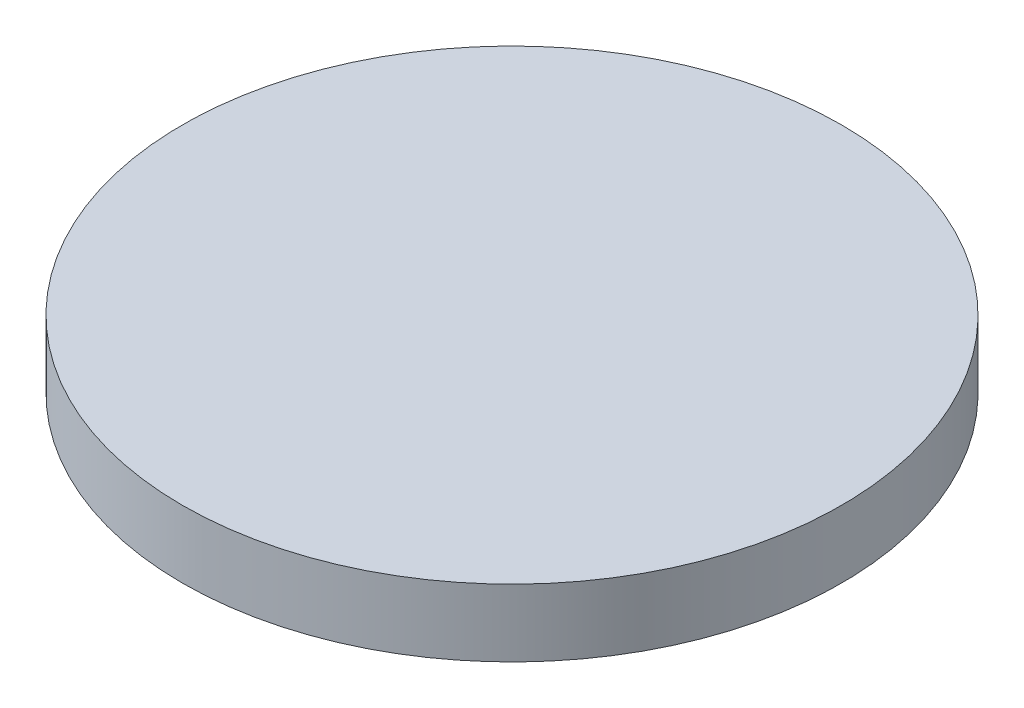
ISO-10303-21;
HEADER;
FILE_DESCRIPTION(('STEP AP214'),'2;1');
FILE_NAME('part.step','',(''),(''),'','','');
FILE_SCHEMA(('AUTOMOTIVE_DESIGN { 1 0 10303 214 1 1 1 1 }'));
ENDSEC;
DATA;
#1=APPLICATION_CONTEXT('core data for automotive mechanical design processes');
#2=APPLICATION_PROTOCOL_DEFINITION('international standard','automotive_design',2000,#1);
#3=PRODUCT_CONTEXT('',#1,'mechanical');
#4=PRODUCT('Part','Part','',(#3));
#5=PRODUCT_RELATED_PRODUCT_CATEGORY('part','',(#4));
#6=PRODUCT_DEFINITION_FORMATION('','',#4);
#7=PRODUCT_DEFINITION_CONTEXT('part definition',#1,'design');
#8=PRODUCT_DEFINITION('design','',#6,#7);
#9=PRODUCT_DEFINITION_SHAPE('','',#8);
#10=(LENGTH_UNIT() NAMED_UNIT(*) SI_UNIT(.MILLI.,.METRE.));
#11=(NAMED_UNIT(*) PLANE_ANGLE_UNIT() SI_UNIT($,.RADIAN.));
#12=(NAMED_UNIT(*) SI_UNIT($,.STERADIAN.) SOLID_ANGLE_UNIT());
#13=UNCERTAINTY_MEASURE_WITH_UNIT(LENGTH_MEASURE(1.E-05),#10,'distance_accuracy_value','');
#14=(GEOMETRIC_REPRESENTATION_CONTEXT(3) GLOBAL_UNCERTAINTY_ASSIGNED_CONTEXT((#13)) GLOBAL_UNIT_ASSIGNED_CONTEXT((#10,
#11,#12)) REPRESENTATION_CONTEXT('',''));
#15=CARTESIAN_POINT('',(0.,0.,0.));
#16=DIRECTION('',(0.,0.,1.));
#17=DIRECTION('',(1.,0.,0.));
#18=AXIS2_PLACEMENT_3D('',#15,#16,#17);
#19=CARTESIAN_POINT('',(0.,18.24,0.));
#20=DIRECTION('',(0.,-1.,0.));
#21=DIRECTION('',(0.,0.,-1.));
#22=AXIS2_PLACEMENT_3D('',#19,#20,#21);
#23=CYLINDRICAL_SURFACE('',#22,89.215);
#24=CARTESIAN_POINT('',(0.,18.24,0.));
#25=DIRECTION('',(0.,1.,0.));
#26=DIRECTION('',(0.,0.,1.));
#27=AXIS2_PLACEMENT_3D('',#24,#25,#26);
#28=CIRCLE('',#27,89.215);
#29=CARTESIAN_POINT('',(0.,18.24,89.215));
#30=VERTEX_POINT('',#29);
#31=EDGE_CURVE('E10',#30,#30,#28,.T.);
#32=ORIENTED_EDGE('',*,*,#31,.F.);
#33=EDGE_LOOP('',(#32));
#34=FACE_BOUND('',#33,.T.);
#35=CARTESIAN_POINT('',(0.,0.,0.));
#36=DIRECTION('',(0.,1.,0.));
#37=DIRECTION('',(0.,0.,1.));
#38=AXIS2_PLACEMENT_3D('',#35,#36,#37);
#39=CIRCLE('',#38,89.215);
#40=CARTESIAN_POINT('',(0.,0.,89.215));
#41=VERTEX_POINT('',#40);
#42=EDGE_CURVE('E38',#41,#41,#39,.T.);
#43=ORIENTED_EDGE('',*,*,#42,.T.);
#44=EDGE_LOOP('',(#43));
#45=FACE_BOUND('',#44,.T.);
#46=ADVANCED_FACE('F35',(#34,#45),#23,.T.);
#47=CARTESIAN_POINT('',(0.,18.24,0.));
#48=DIRECTION('',(0.,1.,0.));
#49=DIRECTION('',(0.,0.,1.));
#50=AXIS2_PLACEMENT_3D('',#47,#48,#49);
#51=PLANE('',#50);
#52=ORIENTED_EDGE('',*,*,#31,.T.);
#53=EDGE_LOOP('',(#52));
#54=FACE_BOUND('',#53,.T.);
#55=ADVANCED_FACE('F50',(#54),#51,.T.);
#56=CARTESIAN_POINT('',(0.,0.,0.));
#57=DIRECTION('',(0.,1.,0.));
#58=DIRECTION('',(0.,0.,1.));
#59=AXIS2_PLACEMENT_3D('',#56,#57,#58);
#60=PLANE('',#59);
#61=ORIENTED_EDGE('',*,*,#42,.F.);
#62=EDGE_LOOP('',(#61));
#63=FACE_BOUND('',#62,.T.);
#64=ADVANCED_FACE('F48',(#63),#60,.F.);
#65=CLOSED_SHELL('',(#46,#55,#64));
#66=MANIFOLD_SOLID_BREP('B2',#65);
#67=ADVANCED_BREP_SHAPE_REPRESENTATION('',(#18,#66),#14);
#68=SHAPE_DEFINITION_REPRESENTATION(#9,#67);
ENDSEC;
END-ISO-10303-21;
